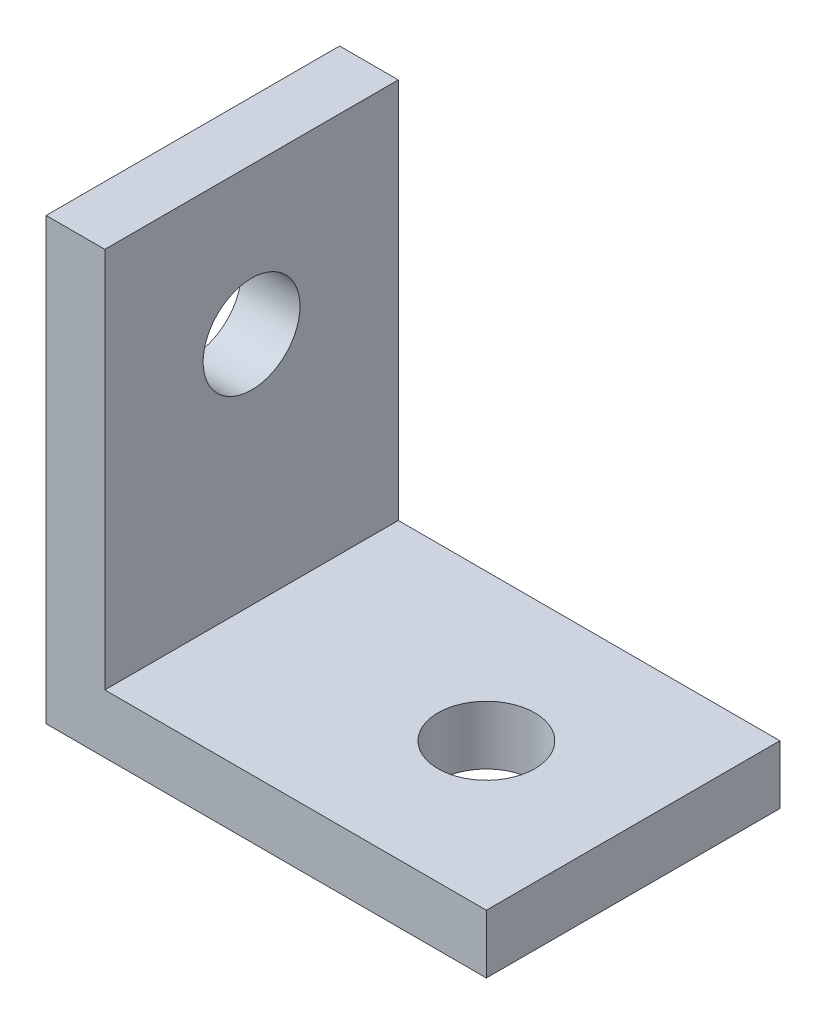
ISO-10303-21;
HEADER;
FILE_DESCRIPTION(('STEP AP214'),'2;1');
FILE_NAME('part.step','',(''),(''),'','','');
FILE_SCHEMA(('AUTOMOTIVE_DESIGN { 1 0 10303 214 1 1 1 1 }'));
ENDSEC;
DATA;
#1=APPLICATION_CONTEXT('core data for automotive mechanical design processes');
#2=APPLICATION_PROTOCOL_DEFINITION('international standard','automotive_design',2000,#1);
#3=PRODUCT_CONTEXT('',#1,'mechanical');
#4=PRODUCT('Part','Part','',(#3));
#5=PRODUCT_RELATED_PRODUCT_CATEGORY('part','',(#4));
#6=PRODUCT_DEFINITION_FORMATION('','',#4);
#7=PRODUCT_DEFINITION_CONTEXT('part definition',#1,'design');
#8=PRODUCT_DEFINITION('design','',#6,#7);
#9=PRODUCT_DEFINITION_SHAPE('','',#8);
#10=(LENGTH_UNIT() NAMED_UNIT(*) SI_UNIT(.MILLI.,.METRE.));
#11=(NAMED_UNIT(*) PLANE_ANGLE_UNIT() SI_UNIT($,.RADIAN.));
#12=(NAMED_UNIT(*) SI_UNIT($,.STERADIAN.) SOLID_ANGLE_UNIT());
#13=UNCERTAINTY_MEASURE_WITH_UNIT(LENGTH_MEASURE(1.E-05),#10,'distance_accuracy_value','');
#14=(GEOMETRIC_REPRESENTATION_CONTEXT(3) GLOBAL_UNCERTAINTY_ASSIGNED_CONTEXT((#13)) GLOBAL_UNIT_ASSIGNED_CONTEXT((#10,
#11,#12)) REPRESENTATION_CONTEXT('',''));
#15=CARTESIAN_POINT('',(0.,0.,0.));
#16=DIRECTION('',(0.,0.,1.));
#17=DIRECTION('',(1.,0.,0.));
#18=AXIS2_PLACEMENT_3D('',#15,#16,#17);
#19=CARTESIAN_POINT('',(0.,15.,10.));
#20=DIRECTION('',(1.,0.,0.));
#21=DIRECTION('',(0.,0.,-1.));
#22=AXIS2_PLACEMENT_3D('',#19,#20,#21);
#23=PLANE('',#22);
#24=CARTESIAN_POINT('',(0.,10.,5.));
#25=DIRECTION('',(1.,0.,0.));
#26=DIRECTION('',(0.,0.,-1.));
#27=AXIS2_PLACEMENT_3D('',#24,#25,#26);
#28=CIRCLE('',#27,1.65);
#29=CARTESIAN_POINT('',(0.,10.,3.35));
#30=VERTEX_POINT('',#29);
#31=EDGE_CURVE('E120',#30,#30,#28,.T.);
#32=ORIENTED_EDGE('',*,*,#31,.T.);
#33=EDGE_LOOP('',(#32));
#34=FACE_BOUND('',#33,.T.);
#35=DIRECTION('',(0.,-1.,0.));
#36=VECTOR('',#35,1.);
#37=CARTESIAN_POINT('',(0.,15.,0.));
#38=LINE('',#37,#36);
#39=CARTESIAN_POINT('',(0.,15.,0.));
#40=VERTEX_POINT('',#39);
#41=CARTESIAN_POINT('',(0.,0.,0.));
#42=VERTEX_POINT('',#41);
#43=EDGE_CURVE('E116',#40,#42,#38,.T.);
#44=ORIENTED_EDGE('',*,*,#43,.T.);
#45=DIRECTION('',(0.,0.,-1.));
#46=VECTOR('',#45,1.);
#47=CARTESIAN_POINT('',(0.,0.,10.));
#48=LINE('',#47,#46);
#49=CARTESIAN_POINT('',(0.,0.,10.));
#50=VERTEX_POINT('',#49);
#51=EDGE_CURVE('E11',#50,#42,#48,.T.);
#52=ORIENTED_EDGE('',*,*,#51,.F.);
#53=DIRECTION('',(0.,-1.,0.));
#54=VECTOR('',#53,1.);
#55=CARTESIAN_POINT('',(0.,15.,10.));
#56=LINE('',#55,#54);
#57=CARTESIAN_POINT('',(0.,15.,10.));
#58=VERTEX_POINT('',#57);
#59=EDGE_CURVE('E127',#58,#50,#56,.T.);
#60=ORIENTED_EDGE('',*,*,#59,.F.);
#61=DIRECTION('',(0.,0.,-1.));
#62=VECTOR('',#61,1.);
#63=CARTESIAN_POINT('',(0.,15.,10.));
#64=LINE('',#63,#62);
#65=EDGE_CURVE('E112',#58,#40,#64,.T.);
#66=ORIENTED_EDGE('',*,*,#65,.T.);
#67=EDGE_LOOP('',(#44,#52,#60,#66));
#68=FACE_BOUND('',#67,.T.);
#69=ADVANCED_FACE('F32',(#34,#68),#23,.F.);
#70=CARTESIAN_POINT('',(0.,0.,10.));
#71=DIRECTION('',(0.,1.,0.));
#72=DIRECTION('',(0.,0.,1.));
#73=AXIS2_PLACEMENT_3D('',#70,#71,#72);
#74=PLANE('',#73);
#75=CARTESIAN_POINT('',(10.,0.,5.));
#76=DIRECTION('',(0.,-1.,0.));
#77=DIRECTION('',(0.,0.,-1.));
#78=AXIS2_PLACEMENT_3D('',#75,#76,#77);
#79=CIRCLE('',#78,1.65);
#80=CARTESIAN_POINT('',(10.,0.,3.35));
#81=VERTEX_POINT('',#80);
#82=EDGE_CURVE('E171',#81,#81,#79,.T.);
#83=ORIENTED_EDGE('',*,*,#82,.F.);
#84=EDGE_LOOP('',(#83));
#85=FACE_BOUND('',#84,.T.);
#86=DIRECTION('',(1.,0.,0.));
#87=VECTOR('',#86,1.);
#88=CARTESIAN_POINT('',(0.,0.,0.));
#89=LINE('',#88,#87);
#90=CARTESIAN_POINT('',(15.,0.,0.));
#91=VERTEX_POINT('',#90);
#92=EDGE_CURVE('E119',#42,#91,#89,.T.);
#93=ORIENTED_EDGE('',*,*,#92,.T.);
#94=DIRECTION('',(0.,0.,-1.));
#95=VECTOR('',#94,1.);
#96=CARTESIAN_POINT('',(15.,0.,10.));
#97=LINE('',#96,#95);
#98=CARTESIAN_POINT('',(15.,0.,10.));
#99=VERTEX_POINT('',#98);
#100=EDGE_CURVE('E40',#99,#91,#97,.T.);
#101=ORIENTED_EDGE('',*,*,#100,.F.);
#102=DIRECTION('',(1.,0.,0.));
#103=VECTOR('',#102,1.);
#104=CARTESIAN_POINT('',(0.,0.,10.));
#105=LINE('',#104,#103);
#106=EDGE_CURVE('E85',#50,#99,#105,.T.);
#107=ORIENTED_EDGE('',*,*,#106,.F.);
#108=ORIENTED_EDGE('',*,*,#51,.T.);
#109=EDGE_LOOP('',(#93,#101,#107,#108));
#110=FACE_BOUND('',#109,.T.);
#111=ADVANCED_FACE('F152',(#85,#110),#74,.F.);
#112=CARTESIAN_POINT('',(15.,0.,10.));
#113=DIRECTION('',(-1.,0.,0.));
#114=DIRECTION('',(0.,0.,1.));
#115=AXIS2_PLACEMENT_3D('',#112,#113,#114);
#116=PLANE('',#115);
#117=DIRECTION('',(0.,1.,0.));
#118=VECTOR('',#117,1.);
#119=CARTESIAN_POINT('',(15.,0.,0.));
#120=LINE('',#119,#118);
#121=CARTESIAN_POINT('',(15.,2.,0.));
#122=VERTEX_POINT('',#121);
#123=EDGE_CURVE('E122',#91,#122,#120,.T.);
#124=ORIENTED_EDGE('',*,*,#123,.T.);
#125=DIRECTION('',(0.,0.,-1.));
#126=VECTOR('',#125,1.);
#127=CARTESIAN_POINT('',(15.,2.,10.));
#128=LINE('',#127,#126);
#129=CARTESIAN_POINT('',(15.,2.,10.));
#130=VERTEX_POINT('',#129);
#131=EDGE_CURVE('E107',#130,#122,#128,.T.);
#132=ORIENTED_EDGE('',*,*,#131,.F.);
#133=DIRECTION('',(0.,1.,0.));
#134=VECTOR('',#133,1.);
#135=CARTESIAN_POINT('',(15.,0.,10.));
#136=LINE('',#135,#134);
#137=EDGE_CURVE('E98',#99,#130,#136,.T.);
#138=ORIENTED_EDGE('',*,*,#137,.F.);
#139=ORIENTED_EDGE('',*,*,#100,.T.);
#140=EDGE_LOOP('',(#124,#132,#138,#139));
#141=FACE_BOUND('',#140,.T.);
#142=ADVANCED_FACE('F133',(#141),#116,.F.);
#143=CARTESIAN_POINT('',(15.,2.,10.));
#144=DIRECTION('',(0.,-1.,0.));
#145=DIRECTION('',(1.,0.,0.));
#146=AXIS2_PLACEMENT_3D('',#143,#144,#145);
#147=PLANE('',#146);
#148=CARTESIAN_POINT('',(10.,2.,5.));
#149=DIRECTION('',(0.,-1.,0.));
#150=DIRECTION('',(1.,0.,0.));
#151=AXIS2_PLACEMENT_3D('',#148,#149,#150);
#152=CIRCLE('',#151,1.65);
#153=CARTESIAN_POINT('',(11.65,2.,5.));
#154=VERTEX_POINT('',#153);
#155=EDGE_CURVE('E164',#154,#154,#152,.T.);
#156=ORIENTED_EDGE('',*,*,#155,.T.);
#157=EDGE_LOOP('',(#156));
#158=FACE_BOUND('',#157,.T.);
#159=DIRECTION('',(-1.,0.,0.));
#160=VECTOR('',#159,1.);
#161=CARTESIAN_POINT('',(15.,2.,0.));
#162=LINE('',#161,#160);
#163=CARTESIAN_POINT('',(2.,2.,0.));
#164=VERTEX_POINT('',#163);
#165=EDGE_CURVE('E106',#122,#164,#162,.T.);
#166=ORIENTED_EDGE('',*,*,#165,.T.);
#167=DIRECTION('',(0.,0.,-1.));
#168=VECTOR('',#167,1.);
#169=CARTESIAN_POINT('',(2.,2.,10.));
#170=LINE('',#169,#168);
#171=CARTESIAN_POINT('',(2.,2.,10.));
#172=VERTEX_POINT('',#171);
#173=EDGE_CURVE('E103',#172,#164,#170,.T.);
#174=ORIENTED_EDGE('',*,*,#173,.F.);
#175=DIRECTION('',(-1.,0.,0.));
#176=VECTOR('',#175,1.);
#177=CARTESIAN_POINT('',(15.,2.,10.));
#178=LINE('',#177,#176);
#179=EDGE_CURVE('E92',#130,#172,#178,.T.);
#180=ORIENTED_EDGE('',*,*,#179,.F.);
#181=ORIENTED_EDGE('',*,*,#131,.T.);
#182=EDGE_LOOP('',(#166,#174,#180,#181));
#183=FACE_BOUND('',#182,.T.);
#184=ADVANCED_FACE('F104',(#158,#183),#147,.F.);
#185=CARTESIAN_POINT('',(2.,2.,10.));
#186=DIRECTION('',(-1.,0.,0.));
#187=DIRECTION('',(0.,0.,1.));
#188=AXIS2_PLACEMENT_3D('',#185,#186,#187);
#189=PLANE('',#188);
#190=CARTESIAN_POINT('',(2.,10.,5.));
#191=DIRECTION('',(1.,0.,0.));
#192=DIRECTION('',(0.,0.,-1.));
#193=AXIS2_PLACEMENT_3D('',#190,#191,#192);
#194=CIRCLE('',#193,1.65);
#195=CARTESIAN_POINT('',(2.,10.,3.35));
#196=VERTEX_POINT('',#195);
#197=EDGE_CURVE('E161',#196,#196,#194,.T.);
#198=ORIENTED_EDGE('',*,*,#197,.F.);
#199=EDGE_LOOP('',(#198));
#200=FACE_BOUND('',#199,.T.);
#201=DIRECTION('',(0.,1.,0.));
#202=VECTOR('',#201,1.);
#203=CARTESIAN_POINT('',(2.,2.,0.));
#204=LINE('',#203,#202);
#205=CARTESIAN_POINT('',(2.,15.,0.));
#206=VERTEX_POINT('',#205);
#207=EDGE_CURVE('E71',#164,#206,#204,.T.);
#208=ORIENTED_EDGE('',*,*,#207,.T.);
#209=DIRECTION('',(0.,0.,-1.));
#210=VECTOR('',#209,1.);
#211=CARTESIAN_POINT('',(2.,15.,10.));
#212=LINE('',#211,#210);
#213=CARTESIAN_POINT('',(2.,15.,10.));
#214=VERTEX_POINT('',#213);
#215=EDGE_CURVE('E108',#214,#206,#212,.T.);
#216=ORIENTED_EDGE('',*,*,#215,.F.);
#217=DIRECTION('',(0.,1.,0.));
#218=VECTOR('',#217,1.);
#219=CARTESIAN_POINT('',(2.,2.,10.));
#220=LINE('',#219,#218);
#221=EDGE_CURVE('E96',#172,#214,#220,.T.);
#222=ORIENTED_EDGE('',*,*,#221,.F.);
#223=ORIENTED_EDGE('',*,*,#173,.T.);
#224=EDGE_LOOP('',(#208,#216,#222,#223));
#225=FACE_BOUND('',#224,.T.);
#226=ADVANCED_FACE('F110',(#200,#225),#189,.F.);
#227=CARTESIAN_POINT('',(2.,15.,10.));
#228=DIRECTION('',(0.,-1.,0.));
#229=DIRECTION('',(0.,0.,-1.));
#230=AXIS2_PLACEMENT_3D('',#227,#228,#229);
#231=PLANE('',#230);
#232=DIRECTION('',(-1.,0.,0.));
#233=VECTOR('',#232,1.);
#234=CARTESIAN_POINT('',(2.,15.,0.));
#235=LINE('',#234,#233);
#236=EDGE_CURVE('E77',#206,#40,#235,.T.);
#237=ORIENTED_EDGE('',*,*,#236,.T.);
#238=ORIENTED_EDGE('',*,*,#65,.F.);
#239=DIRECTION('',(-1.,0.,0.));
#240=VECTOR('',#239,1.);
#241=CARTESIAN_POINT('',(2.,15.,10.));
#242=LINE('',#241,#240);
#243=EDGE_CURVE('E48',#214,#58,#242,.T.);
#244=ORIENTED_EDGE('',*,*,#243,.F.);
#245=ORIENTED_EDGE('',*,*,#215,.T.);
#246=EDGE_LOOP('',(#237,#238,#244,#245));
#247=FACE_BOUND('',#246,.T.);
#248=ADVANCED_FACE('F140',(#247),#231,.F.);
#249=CARTESIAN_POINT('',(0.,0.,10.));
#250=DIRECTION('',(0.,0.,1.));
#251=DIRECTION('',(1.,0.,0.));
#252=AXIS2_PLACEMENT_3D('',#249,#250,#251);
#253=PLANE('',#252);
#254=ORIENTED_EDGE('',*,*,#59,.T.);
#255=ORIENTED_EDGE('',*,*,#106,.T.);
#256=ORIENTED_EDGE('',*,*,#137,.T.);
#257=ORIENTED_EDGE('',*,*,#179,.T.);
#258=ORIENTED_EDGE('',*,*,#221,.T.);
#259=ORIENTED_EDGE('',*,*,#243,.T.);
#260=EDGE_LOOP('',(#254,#255,#256,#257,#258,#259));
#261=FACE_BOUND('',#260,.T.);
#262=ADVANCED_FACE('F94',(#261),#253,.T.);
#263=CARTESIAN_POINT('',(0.,0.,0.));
#264=DIRECTION('',(0.,0.,1.));
#265=DIRECTION('',(1.,0.,0.));
#266=AXIS2_PLACEMENT_3D('',#263,#264,#265);
#267=PLANE('',#266);
#268=ORIENTED_EDGE('',*,*,#43,.F.);
#269=ORIENTED_EDGE('',*,*,#236,.F.);
#270=ORIENTED_EDGE('',*,*,#207,.F.);
#271=ORIENTED_EDGE('',*,*,#165,.F.);
#272=ORIENTED_EDGE('',*,*,#123,.F.);
#273=ORIENTED_EDGE('',*,*,#92,.F.);
#274=EDGE_LOOP('',(#268,#269,#270,#271,#272,#273));
#275=FACE_BOUND('',#274,.T.);
#276=ADVANCED_FACE('F136',(#275),#267,.F.);
#277=CARTESIAN_POINT('',(2.,10.,5.));
#278=DIRECTION('',(1.,0.,0.));
#279=DIRECTION('',(0.,0.,-1.));
#280=AXIS2_PLACEMENT_3D('',#277,#278,#279);
#281=CYLINDRICAL_SURFACE('',#280,1.65);
#282=ORIENTED_EDGE('',*,*,#31,.F.);
#283=EDGE_LOOP('',(#282));
#284=FACE_BOUND('',#283,.T.);
#285=ORIENTED_EDGE('',*,*,#197,.T.);
#286=EDGE_LOOP('',(#285));
#287=FACE_BOUND('',#286,.T.);
#288=ADVANCED_FACE('F178',(#284,#287),#281,.F.);
#289=CARTESIAN_POINT('',(10.,0.,5.));
#290=DIRECTION('',(0.,-1.,0.));
#291=DIRECTION('',(0.,0.,-1.));
#292=AXIS2_PLACEMENT_3D('',#289,#290,#291);
#293=CYLINDRICAL_SURFACE('',#292,1.65);
#294=ORIENTED_EDGE('',*,*,#82,.T.);
#295=EDGE_LOOP('',(#294));
#296=FACE_BOUND('',#295,.T.);
#297=ORIENTED_EDGE('',*,*,#155,.F.);
#298=EDGE_LOOP('',(#297));
#299=FACE_BOUND('',#298,.T.);
#300=ADVANCED_FACE('F175',(#296,#299),#293,.F.);
#301=CLOSED_SHELL('',(#69,#111,#142,#184,#226,#248,#262,#276,#288,#300));
#302=MANIFOLD_SOLID_BREP('B2',#301);
#303=ADVANCED_BREP_SHAPE_REPRESENTATION('',(#18,#302),#14);
#304=SHAPE_DEFINITION_REPRESENTATION(#9,#303);
ENDSEC;
END-ISO-10303-21;
